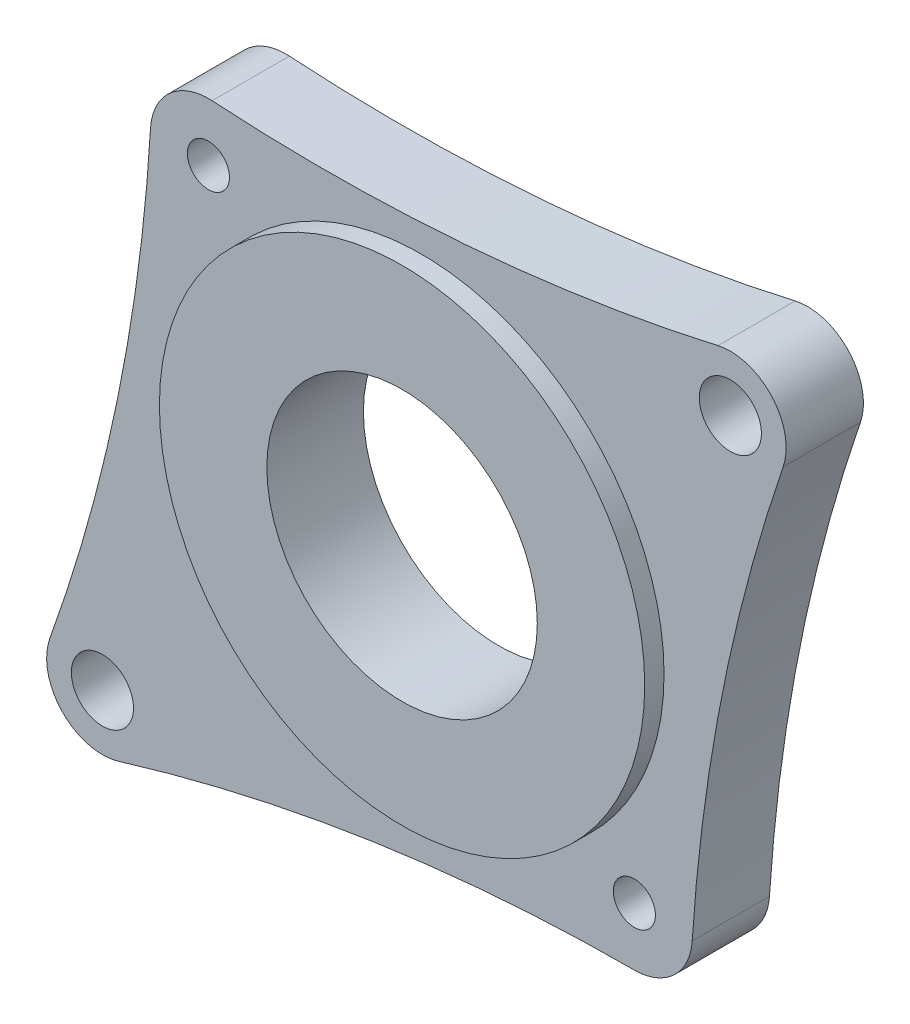
ISO-10303-21;
HEADER;
FILE_DESCRIPTION(('STEP AP214'),'2;1');
FILE_NAME('part.step','',(''),(''),'','','');
FILE_SCHEMA(('AUTOMOTIVE_DESIGN { 1 0 10303 214 1 1 1 1 }'));
ENDSEC;
DATA;
#1=APPLICATION_CONTEXT('core data for automotive mechanical design processes');
#2=APPLICATION_PROTOCOL_DEFINITION('international standard','automotive_design',2000,#1);
#3=PRODUCT_CONTEXT('',#1,'mechanical');
#4=PRODUCT('Part','Part','',(#3));
#5=PRODUCT_RELATED_PRODUCT_CATEGORY('part','',(#4));
#6=PRODUCT_DEFINITION_FORMATION('','',#4);
#7=PRODUCT_DEFINITION_CONTEXT('part definition',#1,'design');
#8=PRODUCT_DEFINITION('design','',#6,#7);
#9=PRODUCT_DEFINITION_SHAPE('','',#8);
#10=(LENGTH_UNIT() NAMED_UNIT(*) SI_UNIT(.MILLI.,.METRE.));
#11=(NAMED_UNIT(*) PLANE_ANGLE_UNIT() SI_UNIT($,.RADIAN.));
#12=(NAMED_UNIT(*) SI_UNIT($,.STERADIAN.) SOLID_ANGLE_UNIT());
#13=UNCERTAINTY_MEASURE_WITH_UNIT(LENGTH_MEASURE(1.E-05),#10,'distance_accuracy_value','');
#14=(GEOMETRIC_REPRESENTATION_CONTEXT(3) GLOBAL_UNCERTAINTY_ASSIGNED_CONTEXT((#13)) GLOBAL_UNIT_ASSIGNED_CONTEXT((#10,
#11,#12)) REPRESENTATION_CONTEXT('',''));
#15=CARTESIAN_POINT('',(0.,0.,0.));
#16=DIRECTION('',(0.,0.,1.));
#17=DIRECTION('',(1.,0.,0.));
#18=AXIS2_PLACEMENT_3D('',#15,#16,#17);
#19=CARTESIAN_POINT('',(8.71211106903296,94.0644996864509,6.35));
#20=DIRECTION('',(0.,0.,1.));
#21=DIRECTION('',(1.,0.,0.));
#22=AXIS2_PLACEMENT_3D('',#19,#20,#21);
#23=PLANE('',#22);
#24=CARTESIAN_POINT('',(-7.96154383244486,166.991578945128,6.35));
#25=DIRECTION('',(0.,0.,-1.));
#26=DIRECTION('',(1.,0.,0.));
#27=AXIS2_PLACEMENT_3D('',#24,#25,#26);
#28=CIRCLE('',#27,145.03307510677);
#29=CARTESIAN_POINT('',(24.3639127104653,25.6067928674942,6.35));
#30=VERTEX_POINT('',#29);
#31=CARTESIAN_POINT('',(-17.1967407250474,22.2528349500224,6.35));
#32=VERTEX_POINT('',#31);
#33=EDGE_CURVE('E167',#30,#32,#28,.T.);
#34=ORIENTED_EDGE('',*,*,#33,.T.);
#35=CARTESIAN_POINT('',(-17.5,17.4999999999999,6.35));
#36=DIRECTION('',(0.,0.,1.));
#37=DIRECTION('',(1.,0.,0.));
#38=AXIS2_PLACEMENT_3D('',#35,#36,#37);
#39=CIRCLE('',#38,4.76249999999998);
#40=CARTESIAN_POINT('',(-22.2542327307741,17.7804949048302,6.35));
#41=VERTEX_POINT('',#40);
#42=EDGE_CURVE('E109',#32,#41,#39,.T.);
#43=ORIENTED_EDGE('',*,*,#42,.T.);
#44=CARTESIAN_POINT('',(-167.035543537584,26.322445266892,6.35));
#45=DIRECTION('',(0.,0.,-1.));
#46=DIRECTION('',(1.,0.,0.));
#47=AXIS2_PLACEMENT_3D('',#44,#45,#46);
#48=CIRCLE('',#47,145.03307510677);
#49=CARTESIAN_POINT('',(-30.5228743925336,-22.6559585231458,6.35));
#50=VERTEX_POINT('',#49);
#51=EDGE_CURVE('E187',#41,#50,#48,.T.);
#52=ORIENTED_EDGE('',*,*,#51,.T.);
#53=CARTESIAN_POINT('',(-26.2075164387112,-24.2042349262413,6.35));
#54=DIRECTION('',(0.,0.,1.));
#55=DIRECTION('',(1.,0.,0.));
#56=AXIS2_PLACEMENT_3D('',#53,#54,#55);
#57=CIRCLE('',#56,4.58470000000003);
#58=CARTESIAN_POINT('',(-24.8681979621896,-28.5889470158144,6.35));
#59=VERTEX_POINT('',#58);
#60=EDGE_CURVE('E200',#50,#59,#57,.T.);
#61=ORIENTED_EDGE('',*,*,#60,.T.);
#62=CARTESIAN_POINT('',(17.4999999999998,-167.29557510677,6.35));
#63=DIRECTION('',(0.,0.,-1.));
#64=DIRECTION('',(1.,0.,0.));
#65=AXIS2_PLACEMENT_3D('',#62,#63,#64);
#66=CIRCLE('',#65,145.03307510677);
#67=CARTESIAN_POINT('',(17.5,-22.2625000000001,6.35));
#68=VERTEX_POINT('',#67);
#69=EDGE_CURVE('E130',#59,#68,#66,.T.);
#70=ORIENTED_EDGE('',*,*,#69,.T.);
#71=CARTESIAN_POINT('',(17.5,-17.5000000000001,6.35));
#72=DIRECTION('',(0.,0.,1.));
#73=DIRECTION('',(1.,0.,0.));
#74=AXIS2_PLACEMENT_3D('',#71,#72,#73);
#75=CIRCLE('',#74,4.7625);
#76=CARTESIAN_POINT('',(22.2525120934046,-17.8082775568271,6.35));
#77=VERTEX_POINT('',#76);
#78=EDGE_CURVE('E124',#68,#77,#75,.T.);
#79=ORIENTED_EDGE('',*,*,#78,.T.);
#80=CARTESIAN_POINT('',(166.981424091006,-27.1962968855438,6.35));
#81=DIRECTION('',(0.,0.,-1.));
#82=DIRECTION('',(1.,0.,0.));
#83=AXIS2_PLACEMENT_3D('',#80,#81,#82);
#84=CIRCLE('',#83,145.03307510677);
#85=CARTESIAN_POINT('',(29.72464624942,19.6563424368181,6.35));
#86=VERTEX_POINT('',#85);
#87=EDGE_CURVE('E128',#77,#86,#84,.T.);
#88=ORIENTED_EDGE('',*,*,#87,.T.);
#89=CARTESIAN_POINT('',(25.3857659705108,21.1374204277736,6.35));
#90=DIRECTION('',(0.,0.,1.));
#91=DIRECTION('',(1.,0.,0.));
#92=AXIS2_PLACEMENT_3D('',#89,#90,#91);
#93=CIRCLE('',#92,4.58470000000001);
#94=EDGE_CURVE('E61',#86,#30,#93,.T.);
#95=ORIENTED_EDGE('',*,*,#94,.T.);
#96=EDGE_LOOP('',(#34,#43,#52,#61,#70,#79,#88,#95));
#97=FACE_BOUND('',#96,.T.);
#98=CARTESIAN_POINT('',(-26.2075164387112,-24.2042349262413,6.35));
#99=DIRECTION('',(0.,0.,1.));
#100=DIRECTION('',(1.,0.,0.));
#101=AXIS2_PLACEMENT_3D('',#98,#99,#100);
#102=CIRCLE('',#101,2.5527);
#103=CARTESIAN_POINT('',(-23.6548164387112,-24.2042349262413,6.35));
#104=VERTEX_POINT('',#103);
#105=EDGE_CURVE('E217',#104,#104,#102,.T.);
#106=ORIENTED_EDGE('',*,*,#105,.F.);
#107=EDGE_LOOP('',(#106));
#108=FACE_BOUND('',#107,.T.);
#109=CARTESIAN_POINT('',(25.3857659705108,21.1374204277736,6.35));
#110=DIRECTION('',(0.,0.,1.));
#111=DIRECTION('',(1.,0.,0.));
#112=AXIS2_PLACEMENT_3D('',#109,#110,#111);
#113=CIRCLE('',#112,2.5527);
#114=CARTESIAN_POINT('',(27.9384659705108,21.1374204277736,6.35));
#115=VERTEX_POINT('',#114);
#116=EDGE_CURVE('E223',#115,#115,#113,.T.);
#117=ORIENTED_EDGE('',*,*,#116,.F.);
#118=EDGE_LOOP('',(#117));
#119=FACE_BOUND('',#118,.T.);
#120=CARTESIAN_POINT('',(-17.5,17.4999999999999,6.35));
#121=DIRECTION('',(0.,0.,1.));
#122=DIRECTION('',(1.,0.,0.));
#123=AXIS2_PLACEMENT_3D('',#120,#121,#122);
#124=CIRCLE('',#123,1.7272);
#125=CARTESIAN_POINT('',(-15.7728,17.4999999999999,6.35));
#126=VERTEX_POINT('',#125);
#127=EDGE_CURVE('E230',#126,#126,#124,.T.);
#128=ORIENTED_EDGE('',*,*,#127,.F.);
#129=EDGE_LOOP('',(#128));
#130=FACE_BOUND('',#129,.T.);
#131=CARTESIAN_POINT('',(17.5,-17.5000000000001,6.35));
#132=DIRECTION('',(0.,0.,1.));
#133=DIRECTION('',(1.,0.,0.));
#134=AXIS2_PLACEMENT_3D('',#131,#132,#133);
#135=CIRCLE('',#134,1.7272);
#136=CARTESIAN_POINT('',(19.2272,-17.5000000000001,6.35));
#137=VERTEX_POINT('',#136);
#138=EDGE_CURVE('E237',#137,#137,#135,.T.);
#139=ORIENTED_EDGE('',*,*,#138,.F.);
#140=EDGE_LOOP('',(#139));
#141=FACE_BOUND('',#140,.T.);
#142=CARTESIAN_POINT('',(0.,0.,6.35));
#143=DIRECTION('',(0.,0.,1.));
#144=DIRECTION('',(1.,0.,0.));
#145=AXIS2_PLACEMENT_3D('',#142,#143,#144);
#146=CIRCLE('',#145,19.939);
#147=CARTESIAN_POINT('',(19.9390000000001,0.,6.35));
#148=VERTEX_POINT('',#147);
#149=EDGE_CURVE('E241',#148,#148,#146,.T.);
#150=ORIENTED_EDGE('',*,*,#149,.F.);
#151=EDGE_LOOP('',(#150));
#152=FACE_BOUND('',#151,.T.);
#153=ADVANCED_FACE('F43',(#97,#108,#119,#130,#141,#152),#23,.T.);
#154=CARTESIAN_POINT('',(-7.96154383244486,166.991578945128,6.35));
#155=DIRECTION('',(0.,0.,-1.));
#156=DIRECTION('',(-1.,0.,0.));
#157=AXIS2_PLACEMENT_3D('',#154,#155,#156);
#158=CYLINDRICAL_SURFACE('',#157,145.03307510677);
#159=CARTESIAN_POINT('',(-7.96154383244486,166.991578945128,0.));
#160=DIRECTION('',(0.,0.,-1.));
#161=DIRECTION('',(1.,0.,0.));
#162=AXIS2_PLACEMENT_3D('',#159,#160,#161);
#163=CIRCLE('',#162,145.03307510677);
#164=CARTESIAN_POINT('',(24.3639127104653,25.6067928674942,0.));
#165=VERTEX_POINT('',#164);
#166=CARTESIAN_POINT('',(-17.1967407250474,22.2528349500224,0.));
#167=VERTEX_POINT('',#166);
#168=EDGE_CURVE('E148',#165,#167,#163,.T.);
#169=ORIENTED_EDGE('',*,*,#168,.T.);
#170=DIRECTION('',(0.,0.,-1.));
#171=VECTOR('',#170,1.);
#172=CARTESIAN_POINT('',(-17.1967407250474,22.2528349500224,6.35));
#173=LINE('',#172,#171);
#174=EDGE_CURVE('E11',#32,#167,#173,.T.);
#175=ORIENTED_EDGE('',*,*,#174,.F.);
#176=ORIENTED_EDGE('',*,*,#33,.F.);
#177=DIRECTION('',(0.,0.,-1.));
#178=VECTOR('',#177,1.);
#179=CARTESIAN_POINT('',(24.3639127104653,25.6067928674942,6.35));
#180=LINE('',#179,#178);
#181=EDGE_CURVE('E144',#30,#165,#180,.T.);
#182=ORIENTED_EDGE('',*,*,#181,.T.);
#183=EDGE_LOOP('',(#169,#175,#176,#182));
#184=FACE_BOUND('',#183,.T.);
#185=ADVANCED_FACE('F45',(#184),#158,.F.);
#186=CARTESIAN_POINT('',(-17.5,17.4999999999999,6.35));
#187=DIRECTION('',(0.,0.,-1.));
#188=DIRECTION('',(-1.,0.,0.));
#189=AXIS2_PLACEMENT_3D('',#186,#187,#188);
#190=CYLINDRICAL_SURFACE('',#189,4.76249999999998);
#191=CARTESIAN_POINT('',(-17.5,17.4999999999999,0.));
#192=DIRECTION('',(0.,0.,1.));
#193=DIRECTION('',(1.,0.,0.));
#194=AXIS2_PLACEMENT_3D('',#191,#192,#193);
#195=CIRCLE('',#194,4.76249999999998);
#196=CARTESIAN_POINT('',(-22.2542327307741,17.7804949048302,0.));
#197=VERTEX_POINT('',#196);
#198=EDGE_CURVE('E151',#167,#197,#195,.T.);
#199=ORIENTED_EDGE('',*,*,#198,.T.);
#200=DIRECTION('',(0.,0.,-1.));
#201=VECTOR('',#200,1.);
#202=CARTESIAN_POINT('',(-22.2542327307741,17.7804949048302,6.35));
#203=LINE('',#202,#201);
#204=EDGE_CURVE('E53',#41,#197,#203,.T.);
#205=ORIENTED_EDGE('',*,*,#204,.F.);
#206=ORIENTED_EDGE('',*,*,#42,.F.);
#207=ORIENTED_EDGE('',*,*,#174,.T.);
#208=EDGE_LOOP('',(#199,#205,#206,#207));
#209=FACE_BOUND('',#208,.T.);
#210=ADVANCED_FACE('F274',(#209),#190,.T.);
#211=CARTESIAN_POINT('',(-167.035543537584,26.322445266892,6.35));
#212=DIRECTION('',(0.,0.,-1.));
#213=DIRECTION('',(-1.,0.,0.));
#214=AXIS2_PLACEMENT_3D('',#211,#212,#213);
#215=CYLINDRICAL_SURFACE('',#214,145.03307510677);
#216=CARTESIAN_POINT('',(-167.035543537584,26.322445266892,0.));
#217=DIRECTION('',(0.,0.,-1.));
#218=DIRECTION('',(1.,0.,0.));
#219=AXIS2_PLACEMENT_3D('',#216,#217,#218);
#220=CIRCLE('',#219,145.03307510677);
#221=CARTESIAN_POINT('',(-30.5228743925336,-22.6559585231458,0.));
#222=VERTEX_POINT('',#221);
#223=EDGE_CURVE('E155',#197,#222,#220,.T.);
#224=ORIENTED_EDGE('',*,*,#223,.T.);
#225=DIRECTION('',(0.,0.,-1.));
#226=VECTOR('',#225,1.);
#227=CARTESIAN_POINT('',(-30.5228743925336,-22.6559585231458,6.35));
#228=LINE('',#227,#226);
#229=EDGE_CURVE('E175',#50,#222,#228,.T.);
#230=ORIENTED_EDGE('',*,*,#229,.F.);
#231=ORIENTED_EDGE('',*,*,#51,.F.);
#232=ORIENTED_EDGE('',*,*,#204,.T.);
#233=EDGE_LOOP('',(#224,#230,#231,#232));
#234=FACE_BOUND('',#233,.T.);
#235=ADVANCED_FACE('F185',(#234),#215,.F.);
#236=CARTESIAN_POINT('',(-26.2075164387112,-24.2042349262413,6.35));
#237=DIRECTION('',(0.,0.,-1.));
#238=DIRECTION('',(-1.,0.,0.));
#239=AXIS2_PLACEMENT_3D('',#236,#237,#238);
#240=CYLINDRICAL_SURFACE('',#239,4.58470000000003);
#241=CARTESIAN_POINT('',(-26.2075164387112,-24.2042349262413,0.));
#242=DIRECTION('',(0.,0.,1.));
#243=DIRECTION('',(1.,0.,0.));
#244=AXIS2_PLACEMENT_3D('',#241,#242,#243);
#245=CIRCLE('',#244,4.58470000000003);
#246=CARTESIAN_POINT('',(-24.8681979621896,-28.5889470158144,0.));
#247=VERTEX_POINT('',#246);
#248=EDGE_CURVE('E158',#222,#247,#245,.T.);
#249=ORIENTED_EDGE('',*,*,#248,.T.);
#250=DIRECTION('',(0.,0.,-1.));
#251=VECTOR('',#250,1.);
#252=CARTESIAN_POINT('',(-24.8681979621896,-28.5889470158144,6.35));
#253=LINE('',#252,#251);
#254=EDGE_CURVE('E171',#59,#247,#253,.T.);
#255=ORIENTED_EDGE('',*,*,#254,.F.);
#256=ORIENTED_EDGE('',*,*,#60,.F.);
#257=ORIENTED_EDGE('',*,*,#229,.T.);
#258=EDGE_LOOP('',(#249,#255,#256,#257));
#259=FACE_BOUND('',#258,.T.);
#260=ADVANCED_FACE('F195',(#259),#240,.T.);
#261=CARTESIAN_POINT('',(17.4999999999998,-167.29557510677,6.35));
#262=DIRECTION('',(0.,0.,-1.));
#263=DIRECTION('',(-1.,0.,0.));
#264=AXIS2_PLACEMENT_3D('',#261,#262,#263);
#265=CYLINDRICAL_SURFACE('',#264,145.03307510677);
#266=CARTESIAN_POINT('',(17.4999999999998,-167.29557510677,0.));
#267=DIRECTION('',(0.,0.,-1.));
#268=DIRECTION('',(1.,0.,0.));
#269=AXIS2_PLACEMENT_3D('',#266,#267,#268);
#270=CIRCLE('',#269,145.03307510677);
#271=CARTESIAN_POINT('',(17.5,-22.2625000000001,0.));
#272=VERTEX_POINT('',#271);
#273=EDGE_CURVE('E161',#247,#272,#270,.T.);
#274=ORIENTED_EDGE('',*,*,#273,.T.);
#275=DIRECTION('',(0.,0.,-1.));
#276=VECTOR('',#275,1.);
#277=CARTESIAN_POINT('',(17.5,-22.2625000000001,6.35));
#278=LINE('',#277,#276);
#279=EDGE_CURVE('E139',#68,#272,#278,.T.);
#280=ORIENTED_EDGE('',*,*,#279,.F.);
#281=ORIENTED_EDGE('',*,*,#69,.F.);
#282=ORIENTED_EDGE('',*,*,#254,.T.);
#283=EDGE_LOOP('',(#274,#280,#281,#282));
#284=FACE_BOUND('',#283,.T.);
#285=ADVANCED_FACE('F198',(#284),#265,.F.);
#286=CARTESIAN_POINT('',(17.5,-17.5000000000001,6.35));
#287=DIRECTION('',(0.,0.,-1.));
#288=DIRECTION('',(-1.,0.,0.));
#289=AXIS2_PLACEMENT_3D('',#286,#287,#288);
#290=CYLINDRICAL_SURFACE('',#289,4.7625);
#291=CARTESIAN_POINT('',(17.5,-17.5000000000001,0.));
#292=DIRECTION('',(0.,0.,1.));
#293=DIRECTION('',(1.,0.,0.));
#294=AXIS2_PLACEMENT_3D('',#291,#292,#293);
#295=CIRCLE('',#294,4.7625);
#296=CARTESIAN_POINT('',(22.2525120934046,-17.8082775568271,0.));
#297=VERTEX_POINT('',#296);
#298=EDGE_CURVE('E138',#272,#297,#295,.T.);
#299=ORIENTED_EDGE('',*,*,#298,.T.);
#300=DIRECTION('',(0.,0.,-1.));
#301=VECTOR('',#300,1.);
#302=CARTESIAN_POINT('',(22.2525120934046,-17.8082775568271,6.35));
#303=LINE('',#302,#301);
#304=EDGE_CURVE('E135',#77,#297,#303,.T.);
#305=ORIENTED_EDGE('',*,*,#304,.F.);
#306=ORIENTED_EDGE('',*,*,#78,.F.);
#307=ORIENTED_EDGE('',*,*,#279,.T.);
#308=EDGE_LOOP('',(#299,#305,#306,#307));
#309=FACE_BOUND('',#308,.T.);
#310=ADVANCED_FACE('F136',(#309),#290,.T.);
#311=CARTESIAN_POINT('',(166.981424091006,-27.1962968855438,6.35));
#312=DIRECTION('',(0.,0.,-1.));
#313=DIRECTION('',(-1.,0.,0.));
#314=AXIS2_PLACEMENT_3D('',#311,#312,#313);
#315=CYLINDRICAL_SURFACE('',#314,145.03307510677);
#316=CARTESIAN_POINT('',(166.981424091006,-27.1962968855438,0.));
#317=DIRECTION('',(0.,0.,-1.));
#318=DIRECTION('',(1.,0.,0.));
#319=AXIS2_PLACEMENT_3D('',#316,#317,#318);
#320=CIRCLE('',#319,145.03307510677);
#321=CARTESIAN_POINT('',(29.72464624942,19.6563424368181,0.));
#322=VERTEX_POINT('',#321);
#323=EDGE_CURVE('E93',#297,#322,#320,.T.);
#324=ORIENTED_EDGE('',*,*,#323,.T.);
#325=DIRECTION('',(0.,0.,-1.));
#326=VECTOR('',#325,1.);
#327=CARTESIAN_POINT('',(29.72464624942,19.6563424368181,6.35));
#328=LINE('',#327,#326);
#329=EDGE_CURVE('E140',#86,#322,#328,.T.);
#330=ORIENTED_EDGE('',*,*,#329,.F.);
#331=ORIENTED_EDGE('',*,*,#87,.F.);
#332=ORIENTED_EDGE('',*,*,#304,.T.);
#333=EDGE_LOOP('',(#324,#330,#331,#332));
#334=FACE_BOUND('',#333,.T.);
#335=ADVANCED_FACE('F142',(#334),#315,.F.);
#336=CARTESIAN_POINT('',(25.3857659705108,21.1374204277736,6.35));
#337=DIRECTION('',(0.,0.,-1.));
#338=DIRECTION('',(-1.,0.,0.));
#339=AXIS2_PLACEMENT_3D('',#336,#337,#338);
#340=CYLINDRICAL_SURFACE('',#339,4.58470000000001);
#341=CARTESIAN_POINT('',(25.3857659705108,21.1374204277736,0.));
#342=DIRECTION('',(0.,0.,1.));
#343=DIRECTION('',(1.,0.,0.));
#344=AXIS2_PLACEMENT_3D('',#341,#342,#343);
#345=CIRCLE('',#344,4.58470000000001);
#346=EDGE_CURVE('E99',#322,#165,#345,.T.);
#347=ORIENTED_EDGE('',*,*,#346,.T.);
#348=ORIENTED_EDGE('',*,*,#181,.F.);
#349=ORIENTED_EDGE('',*,*,#94,.F.);
#350=ORIENTED_EDGE('',*,*,#329,.T.);
#351=EDGE_LOOP('',(#347,#348,#349,#350));
#352=FACE_BOUND('',#351,.T.);
#353=ADVANCED_FACE('F281',(#352),#340,.T.);
#354=CARTESIAN_POINT('',(8.71211106903296,94.0644996864509,0.));
#355=DIRECTION('',(0.,0.,1.));
#356=DIRECTION('',(1.,0.,0.));
#357=AXIS2_PLACEMENT_3D('',#354,#355,#356);
#358=PLANE('',#357);
#359=CARTESIAN_POINT('',(17.5,-17.5000000000001,0.));
#360=DIRECTION('',(0.,0.,1.));
#361=DIRECTION('',(1.,0.,0.));
#362=AXIS2_PLACEMENT_3D('',#359,#360,#361);
#363=CIRCLE('',#362,1.7272);
#364=CARTESIAN_POINT('',(19.2272,-17.5000000000001,0.));
#365=VERTEX_POINT('',#364);
#366=EDGE_CURVE('E234',#365,#365,#363,.T.);
#367=ORIENTED_EDGE('',*,*,#366,.T.);
#368=EDGE_LOOP('',(#367));
#369=FACE_BOUND('',#368,.T.);
#370=CARTESIAN_POINT('',(-17.5,17.4999999999999,0.));
#371=DIRECTION('',(0.,0.,1.));
#372=DIRECTION('',(1.,0.,0.));
#373=AXIS2_PLACEMENT_3D('',#370,#371,#372);
#374=CIRCLE('',#373,1.7272);
#375=CARTESIAN_POINT('',(-15.7728,17.4999999999999,0.));
#376=VERTEX_POINT('',#375);
#377=EDGE_CURVE('E226',#376,#376,#374,.T.);
#378=ORIENTED_EDGE('',*,*,#377,.T.);
#379=EDGE_LOOP('',(#378));
#380=FACE_BOUND('',#379,.T.);
#381=CARTESIAN_POINT('',(25.3857659705108,21.1374204277736,0.));
#382=DIRECTION('',(0.,0.,1.));
#383=DIRECTION('',(1.,0.,0.));
#384=AXIS2_PLACEMENT_3D('',#381,#382,#383);
#385=CIRCLE('',#384,2.5527);
#386=CARTESIAN_POINT('',(27.9384659705108,21.1374204277736,0.));
#387=VERTEX_POINT('',#386);
#388=EDGE_CURVE('E220',#387,#387,#385,.T.);
#389=ORIENTED_EDGE('',*,*,#388,.T.);
#390=EDGE_LOOP('',(#389));
#391=FACE_BOUND('',#390,.T.);
#392=CARTESIAN_POINT('',(-26.2075164387112,-24.2042349262413,0.));
#393=DIRECTION('',(0.,0.,1.));
#394=DIRECTION('',(1.,0.,0.));
#395=AXIS2_PLACEMENT_3D('',#392,#393,#394);
#396=CIRCLE('',#395,2.5527);
#397=CARTESIAN_POINT('',(-23.6548164387112,-24.2042349262413,0.));
#398=VERTEX_POINT('',#397);
#399=EDGE_CURVE('E213',#398,#398,#396,.T.);
#400=ORIENTED_EDGE('',*,*,#399,.T.);
#401=EDGE_LOOP('',(#400));
#402=FACE_BOUND('',#401,.T.);
#403=CARTESIAN_POINT('',(0.,0.,0.));
#404=DIRECTION('',(0.,0.,1.));
#405=DIRECTION('',(1.,0.,0.));
#406=AXIS2_PLACEMENT_3D('',#403,#404,#405);
#407=CIRCLE('',#406,11.1125);
#408=CARTESIAN_POINT('',(11.1125,0.,0.));
#409=VERTEX_POINT('',#408);
#410=EDGE_CURVE('E152',#409,#409,#407,.T.);
#411=ORIENTED_EDGE('',*,*,#410,.T.);
#412=EDGE_LOOP('',(#411));
#413=FACE_BOUND('',#412,.T.);
#414=ORIENTED_EDGE('',*,*,#168,.F.);
#415=ORIENTED_EDGE('',*,*,#346,.F.);
#416=ORIENTED_EDGE('',*,*,#323,.F.);
#417=ORIENTED_EDGE('',*,*,#298,.F.);
#418=ORIENTED_EDGE('',*,*,#273,.F.);
#419=ORIENTED_EDGE('',*,*,#248,.F.);
#420=ORIENTED_EDGE('',*,*,#223,.F.);
#421=ORIENTED_EDGE('',*,*,#198,.F.);
#422=EDGE_LOOP('',(#414,#415,#416,#417,#418,#419,#420,#421));
#423=FACE_BOUND('',#422,.T.);
#424=ADVANCED_FACE('F191',(#369,#380,#391,#402,#413,#423),#358,.F.);
#425=CARTESIAN_POINT('',(0.,0.,6.35));
#426=DIRECTION('',(0.,0.,1.));
#427=DIRECTION('',(1.,0.,0.));
#428=AXIS2_PLACEMENT_3D('',#425,#426,#427);
#429=CYLINDRICAL_SURFACE('',#428,11.1125);
#430=ORIENTED_EDGE('',*,*,#410,.F.);
#431=EDGE_LOOP('',(#430));
#432=FACE_BOUND('',#431,.T.);
#433=CARTESIAN_POINT('',(0.,0.,7.9375));
#434=DIRECTION('',(0.,0.,1.));
#435=DIRECTION('',(1.,0.,0.));
#436=AXIS2_PLACEMENT_3D('',#433,#434,#435);
#437=CIRCLE('',#436,11.1125);
#438=CARTESIAN_POINT('',(11.1125000000001,0.,7.9375));
#439=VERTEX_POINT('',#438);
#440=EDGE_CURVE('E245',#439,#439,#437,.T.);
#441=ORIENTED_EDGE('',*,*,#440,.T.);
#442=EDGE_LOOP('',(#441));
#443=FACE_BOUND('',#442,.T.);
#444=ADVANCED_FACE('F252',(#432,#443),#429,.F.);
#445=CARTESIAN_POINT('',(-26.2075164387112,-24.2042349262413,6.35));
#446=DIRECTION('',(0.,0.,1.));
#447=DIRECTION('',(1.,0.,0.));
#448=AXIS2_PLACEMENT_3D('',#445,#446,#447);
#449=CYLINDRICAL_SURFACE('',#448,2.5527);
#450=ORIENTED_EDGE('',*,*,#399,.F.);
#451=EDGE_LOOP('',(#450));
#452=FACE_BOUND('',#451,.T.);
#453=ORIENTED_EDGE('',*,*,#105,.T.);
#454=EDGE_LOOP('',(#453));
#455=FACE_BOUND('',#454,.T.);
#456=ADVANCED_FACE('F336',(#452,#455),#449,.F.);
#457=CARTESIAN_POINT('',(25.3857659705108,21.1374204277736,6.35));
#458=DIRECTION('',(0.,0.,1.));
#459=DIRECTION('',(1.,0.,0.));
#460=AXIS2_PLACEMENT_3D('',#457,#458,#459);
#461=CYLINDRICAL_SURFACE('',#460,2.5527);
#462=ORIENTED_EDGE('',*,*,#388,.F.);
#463=EDGE_LOOP('',(#462));
#464=FACE_BOUND('',#463,.T.);
#465=ORIENTED_EDGE('',*,*,#116,.T.);
#466=EDGE_LOOP('',(#465));
#467=FACE_BOUND('',#466,.T.);
#468=ADVANCED_FACE('F344',(#464,#467),#461,.F.);
#469=CARTESIAN_POINT('',(-17.5,17.4999999999999,6.35));
#470=DIRECTION('',(0.,0.,1.));
#471=DIRECTION('',(1.,0.,0.));
#472=AXIS2_PLACEMENT_3D('',#469,#470,#471);
#473=CYLINDRICAL_SURFACE('',#472,1.7272);
#474=ORIENTED_EDGE('',*,*,#377,.F.);
#475=EDGE_LOOP('',(#474));
#476=FACE_BOUND('',#475,.T.);
#477=ORIENTED_EDGE('',*,*,#127,.T.);
#478=EDGE_LOOP('',(#477));
#479=FACE_BOUND('',#478,.T.);
#480=ADVANCED_FACE('F266',(#476,#479),#473,.F.);
#481=CARTESIAN_POINT('',(17.5,-17.5000000000001,6.35));
#482=DIRECTION('',(0.,0.,1.));
#483=DIRECTION('',(1.,0.,0.));
#484=AXIS2_PLACEMENT_3D('',#481,#482,#483);
#485=CYLINDRICAL_SURFACE('',#484,1.7272);
#486=ORIENTED_EDGE('',*,*,#366,.F.);
#487=EDGE_LOOP('',(#486));
#488=FACE_BOUND('',#487,.T.);
#489=ORIENTED_EDGE('',*,*,#138,.T.);
#490=EDGE_LOOP('',(#489));
#491=FACE_BOUND('',#490,.T.);
#492=ADVANCED_FACE('F257',(#488,#491),#485,.F.);
#493=CARTESIAN_POINT('',(0.,0.,7.9375));
#494=DIRECTION('',(0.,0.,1.));
#495=DIRECTION('',(1.,0.,0.));
#496=AXIS2_PLACEMENT_3D('',#493,#494,#495);
#497=PLANE('',#496);
#498=CARTESIAN_POINT('',(0.,0.,7.9375));
#499=DIRECTION('',(0.,0.,1.));
#500=DIRECTION('',(1.,0.,0.));
#501=AXIS2_PLACEMENT_3D('',#498,#499,#500);
#502=CIRCLE('',#501,19.939);
#503=CARTESIAN_POINT('',(19.9390000000001,0.,7.9375));
#504=VERTEX_POINT('',#503);
#505=EDGE_CURVE('E240',#504,#504,#502,.T.);
#506=ORIENTED_EDGE('',*,*,#505,.T.);
#507=EDGE_LOOP('',(#506));
#508=FACE_BOUND('',#507,.T.);
#509=ORIENTED_EDGE('',*,*,#440,.F.);
#510=EDGE_LOOP('',(#509));
#511=FACE_BOUND('',#510,.T.);
#512=ADVANCED_FACE('F254',(#508,#511),#497,.T.);
#513=CARTESIAN_POINT('',(0.,0.,7.9375));
#514=DIRECTION('',(0.,0.,-1.));
#515=DIRECTION('',(-1.,0.,0.));
#516=AXIS2_PLACEMENT_3D('',#513,#514,#515);
#517=CYLINDRICAL_SURFACE('',#516,19.939);
#518=ORIENTED_EDGE('',*,*,#505,.F.);
#519=EDGE_LOOP('',(#518));
#520=FACE_BOUND('',#519,.T.);
#521=ORIENTED_EDGE('',*,*,#149,.T.);
#522=EDGE_LOOP('',(#521));
#523=FACE_BOUND('',#522,.T.);
#524=ADVANCED_FACE('F256',(#520,#523),#517,.T.);
#525=CLOSED_SHELL('',(#153,#185,#210,#235,#260,#285,#310,#335,#353,#424,#444,#456,#468,#480,
#492,#512,#524));
#526=MANIFOLD_SOLID_BREP('B2',#525);
#527=ADVANCED_BREP_SHAPE_REPRESENTATION('',(#18,#526),#14);
#528=SHAPE_DEFINITION_REPRESENTATION(#9,#527);
ENDSEC;
END-ISO-10303-21;
